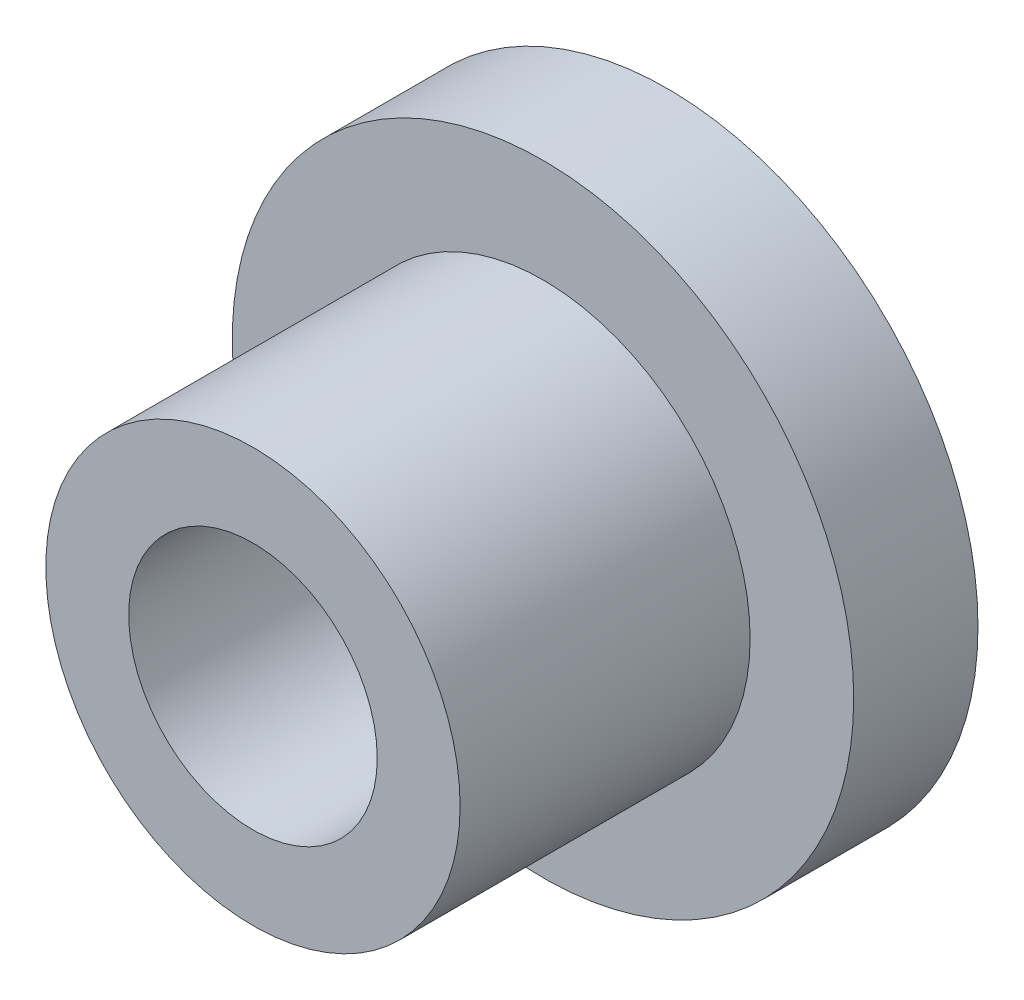
ISO-10303-21;
HEADER;
FILE_DESCRIPTION(('STEP AP214'),'2;1');
FILE_NAME('part.step','',(''),(''),'','','');
FILE_SCHEMA(('AUTOMOTIVE_DESIGN { 1 0 10303 214 1 1 1 1 }'));
ENDSEC;
DATA;
#1=APPLICATION_CONTEXT('core data for automotive mechanical design processes');
#2=APPLICATION_PROTOCOL_DEFINITION('international standard','automotive_design',2000,#1);
#3=PRODUCT_CONTEXT('',#1,'mechanical');
#4=PRODUCT('Part','Part','',(#3));
#5=PRODUCT_RELATED_PRODUCT_CATEGORY('part','',(#4));
#6=PRODUCT_DEFINITION_FORMATION('','',#4);
#7=PRODUCT_DEFINITION_CONTEXT('part definition',#1,'design');
#8=PRODUCT_DEFINITION('design','',#6,#7);
#9=PRODUCT_DEFINITION_SHAPE('','',#8);
#10=(LENGTH_UNIT() NAMED_UNIT(*) SI_UNIT(.MILLI.,.METRE.));
#11=(NAMED_UNIT(*) PLANE_ANGLE_UNIT() SI_UNIT($,.RADIAN.));
#12=(NAMED_UNIT(*) SI_UNIT($,.STERADIAN.) SOLID_ANGLE_UNIT());
#13=UNCERTAINTY_MEASURE_WITH_UNIT(LENGTH_MEASURE(1.E-05),#10,'distance_accuracy_value','');
#14=(GEOMETRIC_REPRESENTATION_CONTEXT(3) GLOBAL_UNCERTAINTY_ASSIGNED_CONTEXT((#13)) GLOBAL_UNIT_ASSIGNED_CONTEXT((#10,
#11,#12)) REPRESENTATION_CONTEXT('',''));
#15=CARTESIAN_POINT('',(0.,0.,0.));
#16=DIRECTION('',(0.,0.,1.));
#17=DIRECTION('',(1.,0.,0.));
#18=AXIS2_PLACEMENT_3D('',#15,#16,#17);
#19=CARTESIAN_POINT('',(0.,0.,6.));
#20=DIRECTION('',(0.,0.,-1.));
#21=DIRECTION('',(-1.,0.,0.));
#22=AXIS2_PLACEMENT_3D('',#19,#20,#21);
#23=CYLINDRICAL_SURFACE('',#22,15.);
#24=CARTESIAN_POINT('',(0.,0.,6.));
#25=DIRECTION('',(0.,0.,1.));
#26=DIRECTION('',(1.,0.,0.));
#27=AXIS2_PLACEMENT_3D('',#24,#25,#26);
#28=CIRCLE('',#27,15.);
#29=CARTESIAN_POINT('',(15.,0.,6.));
#30=VERTEX_POINT('',#29);
#31=EDGE_CURVE('E53',#30,#30,#28,.T.);
#32=ORIENTED_EDGE('',*,*,#31,.F.);
#33=EDGE_LOOP('',(#32));
#34=FACE_BOUND('',#33,.T.);
#35=CARTESIAN_POINT('',(0.,0.,0.));
#36=DIRECTION('',(0.,0.,1.));
#37=DIRECTION('',(1.,0.,0.));
#38=AXIS2_PLACEMENT_3D('',#35,#36,#37);
#39=CIRCLE('',#38,15.);
#40=CARTESIAN_POINT('',(15.,0.,0.));
#41=VERTEX_POINT('',#40);
#42=EDGE_CURVE('E48',#41,#41,#39,.T.);
#43=ORIENTED_EDGE('',*,*,#42,.T.);
#44=EDGE_LOOP('',(#43));
#45=FACE_BOUND('',#44,.T.);
#46=ADVANCED_FACE('F45',(#34,#45),#23,.T.);
#47=CARTESIAN_POINT('',(0.,0.,6.));
#48=DIRECTION('',(0.,0.,1.));
#49=DIRECTION('',(1.,0.,0.));
#50=AXIS2_PLACEMENT_3D('',#47,#48,#49);
#51=PLANE('',#50);
#52=CARTESIAN_POINT('',(0.,0.,6.));
#53=DIRECTION('',(0.,0.,1.));
#54=DIRECTION('',(1.,0.,0.));
#55=AXIS2_PLACEMENT_3D('',#52,#53,#54);
#56=CIRCLE('',#55,10.);
#57=CARTESIAN_POINT('',(10.,0.,6.));
#58=VERTEX_POINT('',#57);
#59=EDGE_CURVE('E10',#58,#58,#56,.T.);
#60=ORIENTED_EDGE('',*,*,#59,.F.);
#61=EDGE_LOOP('',(#60));
#62=FACE_BOUND('',#61,.T.);
#63=ORIENTED_EDGE('',*,*,#31,.T.);
#64=EDGE_LOOP('',(#63));
#65=FACE_BOUND('',#64,.T.);
#66=ADVANCED_FACE('F95',(#62,#65),#51,.T.);
#67=CARTESIAN_POINT('',(0.,0.,0.));
#68=DIRECTION('',(0.,0.,1.));
#69=DIRECTION('',(1.,0.,0.));
#70=AXIS2_PLACEMENT_3D('',#67,#68,#69);
#71=PLANE('',#70);
#72=CARTESIAN_POINT('',(0.,0.,0.));
#73=DIRECTION('',(0.,0.,1.));
#74=DIRECTION('',(1.,0.,0.));
#75=AXIS2_PLACEMENT_3D('',#72,#73,#74);
#76=CIRCLE('',#75,6.);
#77=CARTESIAN_POINT('',(6.,0.,0.));
#78=VERTEX_POINT('',#77);
#79=EDGE_CURVE('E64',#78,#78,#76,.T.);
#80=ORIENTED_EDGE('',*,*,#79,.T.);
#81=EDGE_LOOP('',(#80));
#82=FACE_BOUND('',#81,.T.);
#83=ORIENTED_EDGE('',*,*,#42,.F.);
#84=EDGE_LOOP('',(#83));
#85=FACE_BOUND('',#84,.T.);
#86=ADVANCED_FACE('F73',(#82,#85),#71,.F.);
#87=CARTESIAN_POINT('',(0.,0.,20.));
#88=DIRECTION('',(0.,0.,-1.));
#89=DIRECTION('',(-1.,0.,0.));
#90=AXIS2_PLACEMENT_3D('',#87,#88,#89);
#91=CYLINDRICAL_SURFACE('',#90,10.);
#92=CARTESIAN_POINT('',(0.,0.,20.));
#93=DIRECTION('',(0.,0.,1.));
#94=DIRECTION('',(1.,0.,0.));
#95=AXIS2_PLACEMENT_3D('',#92,#93,#94);
#96=CIRCLE('',#95,10.);
#97=CARTESIAN_POINT('',(10.,0.,20.));
#98=VERTEX_POINT('',#97);
#99=EDGE_CURVE('E60',#98,#98,#96,.T.);
#100=ORIENTED_EDGE('',*,*,#99,.F.);
#101=EDGE_LOOP('',(#100));
#102=FACE_BOUND('',#101,.T.);
#103=ORIENTED_EDGE('',*,*,#59,.T.);
#104=EDGE_LOOP('',(#103));
#105=FACE_BOUND('',#104,.T.);
#106=ADVANCED_FACE('F85',(#102,#105),#91,.T.);
#107=CARTESIAN_POINT('',(0.,0.,20.));
#108=DIRECTION('',(0.,0.,1.));
#109=DIRECTION('',(1.,0.,0.));
#110=AXIS2_PLACEMENT_3D('',#107,#108,#109);
#111=PLANE('',#110);
#112=CARTESIAN_POINT('',(0.,0.,20.));
#113=DIRECTION('',(0.,0.,1.));
#114=DIRECTION('',(1.,0.,0.));
#115=AXIS2_PLACEMENT_3D('',#112,#113,#114);
#116=CIRCLE('',#115,6.);
#117=CARTESIAN_POINT('',(6.,0.,20.));
#118=VERTEX_POINT('',#117);
#119=EDGE_CURVE('E65',#118,#118,#116,.T.);
#120=ORIENTED_EDGE('',*,*,#119,.F.);
#121=EDGE_LOOP('',(#120));
#122=FACE_BOUND('',#121,.T.);
#123=ORIENTED_EDGE('',*,*,#99,.T.);
#124=EDGE_LOOP('',(#123));
#125=FACE_BOUND('',#124,.T.);
#126=ADVANCED_FACE('F79',(#122,#125),#111,.T.);
#127=CARTESIAN_POINT('',(0.,0.,0.));
#128=DIRECTION('',(0.,0.,1.));
#129=DIRECTION('',(1.,0.,0.));
#130=AXIS2_PLACEMENT_3D('',#127,#128,#129);
#131=CYLINDRICAL_SURFACE('',#130,6.);
#132=ORIENTED_EDGE('',*,*,#79,.F.);
#133=EDGE_LOOP('',(#132));
#134=FACE_BOUND('',#133,.T.);
#135=ORIENTED_EDGE('',*,*,#119,.T.);
#136=EDGE_LOOP('',(#135));
#137=FACE_BOUND('',#136,.T.);
#138=ADVANCED_FACE('F76',(#134,#137),#131,.F.);
#139=CLOSED_SHELL('',(#46,#66,#86,#106,#126,#138));
#140=MANIFOLD_SOLID_BREP('B2',#139);
#141=ADVANCED_BREP_SHAPE_REPRESENTATION('',(#18,#140),#14);
#142=SHAPE_DEFINITION_REPRESENTATION(#9,#141);
ENDSEC;
END-ISO-10303-21;
